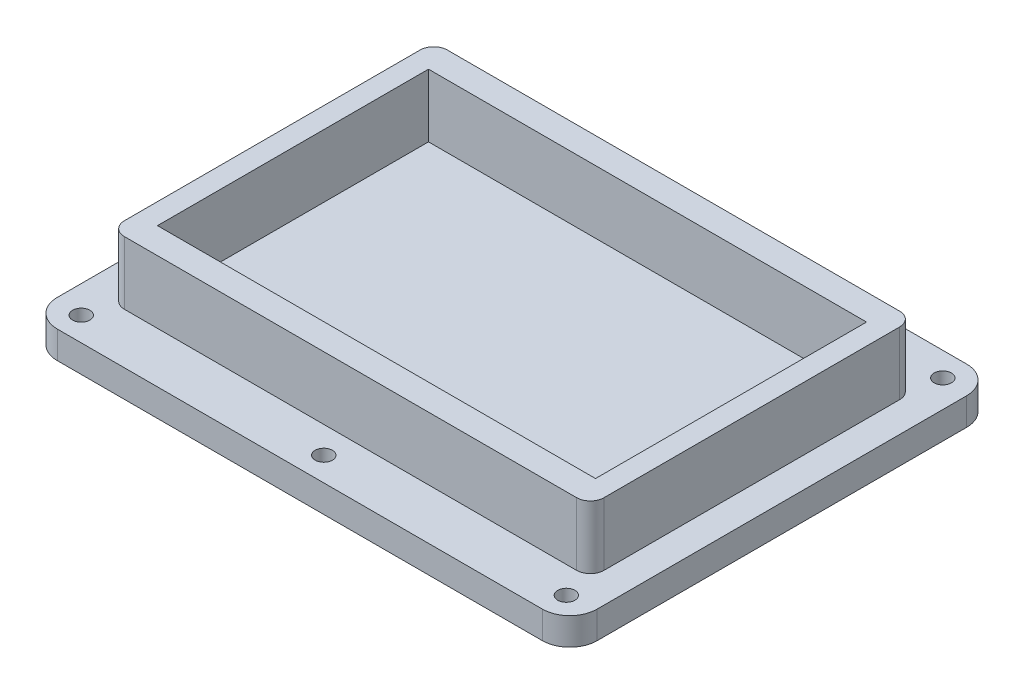
ISO-10303-21;
HEADER;
FILE_DESCRIPTION(('STEP AP214'),'2;1');
FILE_NAME('part.step','',(''),(''),'','','');
FILE_SCHEMA(('AUTOMOTIVE_DESIGN { 1 0 10303 214 1 1 1 1 }'));
ENDSEC;
DATA;
#1=APPLICATION_CONTEXT('core data for automotive mechanical design processes');
#2=APPLICATION_PROTOCOL_DEFINITION('international standard','automotive_design',2000,#1);
#3=PRODUCT_CONTEXT('',#1,'mechanical');
#4=PRODUCT('Part','Part','',(#3));
#5=PRODUCT_RELATED_PRODUCT_CATEGORY('part','',(#4));
#6=PRODUCT_DEFINITION_FORMATION('','',#4);
#7=PRODUCT_DEFINITION_CONTEXT('part definition',#1,'design');
#8=PRODUCT_DEFINITION('design','',#6,#7);
#9=PRODUCT_DEFINITION_SHAPE('','',#8);
#10=(LENGTH_UNIT() NAMED_UNIT(*) SI_UNIT(.MILLI.,.METRE.));
#11=(NAMED_UNIT(*) PLANE_ANGLE_UNIT() SI_UNIT($,.RADIAN.));
#12=(NAMED_UNIT(*) SI_UNIT($,.STERADIAN.) SOLID_ANGLE_UNIT());
#13=UNCERTAINTY_MEASURE_WITH_UNIT(LENGTH_MEASURE(1.E-05),#10,'distance_accuracy_value','');
#14=(GEOMETRIC_REPRESENTATION_CONTEXT(3) GLOBAL_UNCERTAINTY_ASSIGNED_CONTEXT((#13)) GLOBAL_UNIT_ASSIGNED_CONTEXT((#10,
#11,#12)) REPRESENTATION_CONTEXT('',''));
#15=CARTESIAN_POINT('',(0.,0.,0.));
#16=DIRECTION('',(0.,0.,1.));
#17=DIRECTION('',(1.,0.,0.));
#18=AXIS2_PLACEMENT_3D('',#15,#16,#17);
#19=CARTESIAN_POINT('',(0.,2.54,0.));
#20=DIRECTION('',(0.,1.,0.));
#21=DIRECTION('',(0.,0.,1.));
#22=AXIS2_PLACEMENT_3D('',#19,#20,#21);
#23=PLANE('',#22);
#24=CARTESIAN_POINT('',(-62.319486882684,2.54,-17.1109355296889));
#25=DIRECTION('',(0.,1.,0.));
#26=DIRECTION('',(0.,0.,1.));
#27=AXIS2_PLACEMENT_3D('',#24,#25,#26);
#28=CIRCLE('',#27,0.799999999999992);
#29=CARTESIAN_POINT('',(-62.319486882684,2.54,-16.3109355296889));
#30=VERTEX_POINT('',#29);
#31=EDGE_CURVE('E212',#30,#30,#28,.T.);
#32=ORIENTED_EDGE('',*,*,#31,.F.);
#33=EDGE_LOOP('',(#32));
#34=FACE_BOUND('',#33,.T.);
#35=CARTESIAN_POINT('',(-39.815086882684,2.54,-17.1109355296889));
#36=DIRECTION('',(0.,1.,0.));
#37=DIRECTION('',(0.,0.,1.));
#38=AXIS2_PLACEMENT_3D('',#35,#36,#37);
#39=CIRCLE('',#38,0.799999999999992);
#40=CARTESIAN_POINT('',(-39.815086882684,2.54,-16.3109355296889));
#41=VERTEX_POINT('',#40);
#42=EDGE_CURVE('E218',#41,#41,#39,.T.);
#43=ORIENTED_EDGE('',*,*,#42,.F.);
#44=EDGE_LOOP('',(#43));
#45=FACE_BOUND('',#44,.T.);
#46=CARTESIAN_POINT('',(-17.310686882684,2.54,-17.1109355296889));
#47=DIRECTION('',(0.,1.,0.));
#48=DIRECTION('',(0.,0.,1.));
#49=AXIS2_PLACEMENT_3D('',#46,#47,#48);
#50=CIRCLE('',#49,0.799999999999993);
#51=CARTESIAN_POINT('',(-17.310686882684,2.54,-16.3109355296889));
#52=VERTEX_POINT('',#51);
#53=EDGE_CURVE('E224',#52,#52,#50,.T.);
#54=ORIENTED_EDGE('',*,*,#53,.F.);
#55=EDGE_LOOP('',(#54));
#56=FACE_BOUND('',#55,.T.);
#57=CARTESIAN_POINT('',(-17.310686882684,2.54,-52.0359355296889));
#58=DIRECTION('',(0.,1.,0.));
#59=DIRECTION('',(0.,0.,1.));
#60=AXIS2_PLACEMENT_3D('',#57,#58,#59);
#61=CIRCLE('',#60,0.799999999999993);
#62=CARTESIAN_POINT('',(-17.310686882684,2.54,-51.2359355296889));
#63=VERTEX_POINT('',#62);
#64=EDGE_CURVE('E230',#63,#63,#61,.T.);
#65=ORIENTED_EDGE('',*,*,#64,.F.);
#66=EDGE_LOOP('',(#65));
#67=FACE_BOUND('',#66,.T.);
#68=CARTESIAN_POINT('',(-39.815086882684,2.54,-52.0359355296889));
#69=DIRECTION('',(0.,1.,0.));
#70=DIRECTION('',(0.,0.,1.));
#71=AXIS2_PLACEMENT_3D('',#68,#69,#70);
#72=CIRCLE('',#71,0.799999999999992);
#73=CARTESIAN_POINT('',(-39.815086882684,2.54,-51.2359355296889));
#74=VERTEX_POINT('',#73);
#75=EDGE_CURVE('E236',#74,#74,#72,.T.);
#76=ORIENTED_EDGE('',*,*,#75,.F.);
#77=EDGE_LOOP('',(#76));
#78=FACE_BOUND('',#77,.T.);
#79=CARTESIAN_POINT('',(-62.319486882684,2.54,-52.0359355296889));
#80=DIRECTION('',(0.,1.,0.));
#81=DIRECTION('',(0.,0.,1.));
#82=AXIS2_PLACEMENT_3D('',#79,#80,#81);
#83=CIRCLE('',#82,0.799999999999992);
#84=CARTESIAN_POINT('',(-62.319486882684,2.54,-51.2359355296889));
#85=VERTEX_POINT('',#84);
#86=EDGE_CURVE('E242',#85,#85,#83,.T.);
#87=ORIENTED_EDGE('',*,*,#86,.F.);
#88=EDGE_LOOP('',(#87));
#89=FACE_BOUND('',#88,.T.);
#90=DIRECTION('',(0.,0.,1.));
#91=VECTOR('',#90,1.);
#92=CARTESIAN_POINT('',(-64.859486882684,2.54,-54.2584355296889));
#93=LINE('',#92,#91);
#94=CARTESIAN_POINT('',(-64.859486882684,2.54,-51.7184355296889));
#95=VERTEX_POINT('',#94);
#96=CARTESIAN_POINT('',(-64.859486882684,2.54,-17.4284355296889));
#97=VERTEX_POINT('',#96);
#98=EDGE_CURVE('E269',#95,#97,#93,.T.);
#99=ORIENTED_EDGE('',*,*,#98,.T.);
#100=CARTESIAN_POINT('',(-62.319486882684,2.54,-17.4284355296889));
#101=DIRECTION('',(0.,1.,0.));
#102=DIRECTION('',(0.,0.,1.));
#103=AXIS2_PLACEMENT_3D('',#100,#101,#102);
#104=CIRCLE('',#103,2.54);
#105=CARTESIAN_POINT('',(-62.319486882684,2.54,-14.8884355296889));
#106=VERTEX_POINT('',#105);
#107=EDGE_CURVE('E316',#97,#106,#104,.T.);
#108=ORIENTED_EDGE('',*,*,#107,.T.);
#109=DIRECTION('',(1.,0.,0.));
#110=VECTOR('',#109,1.);
#111=CARTESIAN_POINT('',(-64.859486882684,2.54,-14.8884355296889));
#112=LINE('',#111,#110);
#113=CARTESIAN_POINT('',(-17.310686882684,2.54,-14.8884355296889));
#114=VERTEX_POINT('',#113);
#115=EDGE_CURVE('E272',#106,#114,#112,.T.);
#116=ORIENTED_EDGE('',*,*,#115,.T.);
#117=CARTESIAN_POINT('',(-17.310686882684,2.54,-17.4284355296889));
#118=DIRECTION('',(0.,1.,0.));
#119=DIRECTION('',(0.,0.,1.));
#120=AXIS2_PLACEMENT_3D('',#117,#118,#119);
#121=CIRCLE('',#120,2.54);
#122=CARTESIAN_POINT('',(-14.770686882684,2.54,-17.4284355296889));
#123=VERTEX_POINT('',#122);
#124=EDGE_CURVE('E314',#114,#123,#121,.T.);
#125=ORIENTED_EDGE('',*,*,#124,.T.);
#126=DIRECTION('',(0.,0.,-1.));
#127=VECTOR('',#126,1.);
#128=CARTESIAN_POINT('',(-14.770686882684,2.54,-54.2584355296889));
#129=LINE('',#128,#127);
#130=CARTESIAN_POINT('',(-14.770686882684,2.54,-51.7184355296889));
#131=VERTEX_POINT('',#130);
#132=EDGE_CURVE('E276',#123,#131,#129,.T.);
#133=ORIENTED_EDGE('',*,*,#132,.T.);
#134=CARTESIAN_POINT('',(-17.310686882684,2.54,-51.7184355296889));
#135=DIRECTION('',(0.,1.,0.));
#136=DIRECTION('',(0.,0.,1.));
#137=AXIS2_PLACEMENT_3D('',#134,#135,#136);
#138=CIRCLE('',#137,2.54);
#139=CARTESIAN_POINT('',(-17.310686882684,2.54,-54.2584355296889));
#140=VERTEX_POINT('',#139);
#141=EDGE_CURVE('E312',#131,#140,#138,.T.);
#142=ORIENTED_EDGE('',*,*,#141,.T.);
#143=DIRECTION('',(-1.,0.,0.));
#144=VECTOR('',#143,1.);
#145=CARTESIAN_POINT('',(-64.859486882684,2.54,-54.2584355296889));
#146=LINE('',#145,#144);
#147=CARTESIAN_POINT('',(-62.319486882684,2.54,-54.2584355296889));
#148=VERTEX_POINT('',#147);
#149=EDGE_CURVE('E279',#140,#148,#146,.T.);
#150=ORIENTED_EDGE('',*,*,#149,.T.);
#151=CARTESIAN_POINT('',(-62.319486882684,2.54,-51.7184355296889));
#152=DIRECTION('',(0.,1.,0.));
#153=DIRECTION('',(0.,0.,1.));
#154=AXIS2_PLACEMENT_3D('',#151,#152,#153);
#155=CIRCLE('',#154,2.54);
#156=EDGE_CURVE('E310',#148,#95,#155,.T.);
#157=ORIENTED_EDGE('',*,*,#156,.T.);
#158=EDGE_LOOP('',(#99,#108,#116,#125,#133,#142,#150,#157));
#159=FACE_BOUND('',#158,.T.);
#160=DIRECTION('',(1.,0.,0.));
#161=VECTOR('',#160,1.);
#162=CARTESIAN_POINT('',(-62.065486882684,2.54,-19.5874355296889));
#163=LINE('',#162,#161);
#164=CARTESIAN_POINT('',(-60.795486882684,2.54,-19.5874355296889));
#165=VERTEX_POINT('',#164);
#166=CARTESIAN_POINT('',(-18.834686882684,2.54,-19.5874355296889));
#167=VERTEX_POINT('',#166);
#168=EDGE_CURVE('E262',#165,#167,#163,.T.);
#169=ORIENTED_EDGE('',*,*,#168,.F.);
#170=CARTESIAN_POINT('',(-60.795486882684,2.54,-20.8574355296889));
#171=DIRECTION('',(0.,1.,0.));
#172=DIRECTION('',(0.,0.,1.));
#173=AXIS2_PLACEMENT_3D('',#170,#171,#172);
#174=CIRCLE('',#173,1.27);
#175=CARTESIAN_POINT('',(-62.065486882684,2.54,-20.8574355296889));
#176=VERTEX_POINT('',#175);
#177=EDGE_CURVE('E356',#165,#176,#174,.F.);
#178=ORIENTED_EDGE('',*,*,#177,.T.);
#179=DIRECTION('',(0.,0.,1.));
#180=VECTOR('',#179,1.);
#181=CARTESIAN_POINT('',(-62.065486882684,2.54,-49.5594355296889));
#182=LINE('',#181,#180);
#183=CARTESIAN_POINT('',(-62.065486882684,2.54,-48.2894355296889));
#184=VERTEX_POINT('',#183);
#185=EDGE_CURVE('E245',#184,#176,#182,.T.);
#186=ORIENTED_EDGE('',*,*,#185,.F.);
#187=CARTESIAN_POINT('',(-60.795486882684,2.54,-48.2894355296889));
#188=DIRECTION('',(0.,1.,0.));
#189=DIRECTION('',(0.,0.,1.));
#190=AXIS2_PLACEMENT_3D('',#187,#188,#189);
#191=CIRCLE('',#190,1.27);
#192=CARTESIAN_POINT('',(-60.795486882684,2.54,-49.5594355296889));
#193=VERTEX_POINT('',#192);
#194=EDGE_CURVE('E11',#184,#193,#191,.F.);
#195=ORIENTED_EDGE('',*,*,#194,.T.);
#196=DIRECTION('',(-1.,0.,0.));
#197=VECTOR('',#196,1.);
#198=CARTESIAN_POINT('',(-62.065486882684,2.54,-49.5594355296889));
#199=LINE('',#198,#197);
#200=CARTESIAN_POINT('',(-18.834686882684,2.54,-49.5594355296889));
#201=VERTEX_POINT('',#200);
#202=EDGE_CURVE('E250',#201,#193,#199,.T.);
#203=ORIENTED_EDGE('',*,*,#202,.F.);
#204=CARTESIAN_POINT('',(-18.834686882684,2.54,-48.2894355296889));
#205=DIRECTION('',(0.,1.,0.));
#206=DIRECTION('',(0.,0.,1.));
#207=AXIS2_PLACEMENT_3D('',#204,#205,#206);
#208=CIRCLE('',#207,1.27);
#209=CARTESIAN_POINT('',(-17.564686882684,2.54,-48.2894355296889));
#210=VERTEX_POINT('',#209);
#211=EDGE_CURVE('E43',#201,#210,#208,.F.);
#212=ORIENTED_EDGE('',*,*,#211,.T.);
#213=DIRECTION('',(0.,0.,-1.));
#214=VECTOR('',#213,1.);
#215=CARTESIAN_POINT('',(-17.564686882684,2.54,-49.5594355296889));
#216=LINE('',#215,#214);
#217=CARTESIAN_POINT('',(-17.564686882684,2.54,-20.8574355296889));
#218=VERTEX_POINT('',#217);
#219=EDGE_CURVE('E265',#218,#210,#216,.T.);
#220=ORIENTED_EDGE('',*,*,#219,.F.);
#221=CARTESIAN_POINT('',(-18.834686882684,2.54,-20.8574355296889));
#222=DIRECTION('',(0.,1.,0.));
#223=DIRECTION('',(0.,0.,1.));
#224=AXIS2_PLACEMENT_3D('',#221,#222,#223);
#225=CIRCLE('',#224,1.27);
#226=EDGE_CURVE('E358',#218,#167,#225,.F.);
#227=ORIENTED_EDGE('',*,*,#226,.T.);
#228=EDGE_LOOP('',(#169,#178,#186,#195,#203,#212,#220,#227));
#229=FACE_BOUND('',#228,.T.);
#230=ADVANCED_FACE('F35',(#34,#45,#56,#67,#78,#89,#159,#229),#23,.T.);
#231=CARTESIAN_POINT('',(-64.859486882684,2.54,-54.2584355296889));
#232=DIRECTION('',(1.,0.,0.));
#233=DIRECTION('',(0.,0.,-1.));
#234=AXIS2_PLACEMENT_3D('',#231,#232,#233);
#235=PLANE('',#234);
#236=DIRECTION('',(0.,0.,1.));
#237=VECTOR('',#236,1.);
#238=CARTESIAN_POINT('',(-64.859486882684,0.,-54.2584355296889));
#239=LINE('',#238,#237);
#240=CARTESIAN_POINT('',(-64.859486882684,0.,-51.7184355296889));
#241=VERTEX_POINT('',#240);
#242=CARTESIAN_POINT('',(-64.859486882684,0.,-17.4284355296889));
#243=VERTEX_POINT('',#242);
#244=EDGE_CURVE('E259',#241,#243,#239,.T.);
#245=ORIENTED_EDGE('',*,*,#244,.T.);
#246=DIRECTION('',(0.,-1.,0.));
#247=VECTOR('',#246,1.);
#248=CARTESIAN_POINT('',(-64.859486882684,2.54,-17.4284355296889));
#249=LINE('',#248,#247);
#250=EDGE_CURVE('E308',#243,#97,#249,.F.);
#251=ORIENTED_EDGE('',*,*,#250,.T.);
#252=ORIENTED_EDGE('',*,*,#98,.F.);
#253=DIRECTION('',(0.,-1.,0.));
#254=VECTOR('',#253,1.);
#255=CARTESIAN_POINT('',(-64.859486882684,2.54,-51.7184355296889));
#256=LINE('',#255,#254);
#257=EDGE_CURVE('E305',#95,#241,#256,.T.);
#258=ORIENTED_EDGE('',*,*,#257,.T.);
#259=EDGE_LOOP('',(#245,#251,#252,#258));
#260=FACE_BOUND('',#259,.T.);
#261=ADVANCED_FACE('F403',(#260),#235,.F.);
#262=CARTESIAN_POINT('',(-64.859486882684,2.54,-14.8884355296889));
#263=DIRECTION('',(0.,0.,-1.));
#264=DIRECTION('',(-1.,0.,0.));
#265=AXIS2_PLACEMENT_3D('',#262,#263,#264);
#266=PLANE('',#265);
#267=ORIENTED_EDGE('',*,*,#115,.F.);
#268=DIRECTION('',(0.,-1.,0.));
#269=VECTOR('',#268,1.);
#270=CARTESIAN_POINT('',(-62.319486882684,2.54,-14.8884355296889));
#271=LINE('',#270,#269);
#272=CARTESIAN_POINT('',(-62.319486882684,0.,-14.8884355296889));
#273=VERTEX_POINT('',#272);
#274=EDGE_CURVE('E294',#106,#273,#271,.T.);
#275=ORIENTED_EDGE('',*,*,#274,.T.);
#276=DIRECTION('',(1.,0.,0.));
#277=VECTOR('',#276,1.);
#278=CARTESIAN_POINT('',(-64.859486882684,0.,-14.8884355296889));
#279=LINE('',#278,#277);
#280=CARTESIAN_POINT('',(-17.310686882684,0.,-14.8884355296889));
#281=VERTEX_POINT('',#280);
#282=EDGE_CURVE('E285',#273,#281,#279,.T.);
#283=ORIENTED_EDGE('',*,*,#282,.T.);
#284=DIRECTION('',(0.,-1.,0.));
#285=VECTOR('',#284,1.);
#286=CARTESIAN_POINT('',(-17.310686882684,2.54,-14.8884355296889));
#287=LINE('',#286,#285);
#288=EDGE_CURVE('E282',#281,#114,#287,.F.);
#289=ORIENTED_EDGE('',*,*,#288,.T.);
#290=EDGE_LOOP('',(#267,#275,#283,#289));
#291=FACE_BOUND('',#290,.T.);
#292=ADVANCED_FACE('F409',(#291),#266,.F.);
#293=CARTESIAN_POINT('',(-14.770686882684,2.54,-54.2584355296889));
#294=DIRECTION('',(-1.,0.,0.));
#295=DIRECTION('',(0.,0.,1.));
#296=AXIS2_PLACEMENT_3D('',#293,#294,#295);
#297=PLANE('',#296);
#298=ORIENTED_EDGE('',*,*,#132,.F.);
#299=DIRECTION('',(0.,-1.,0.));
#300=VECTOR('',#299,1.);
#301=CARTESIAN_POINT('',(-14.770686882684,2.54,-17.4284355296889));
#302=LINE('',#301,#300);
#303=CARTESIAN_POINT('',(-14.770686882684,0.,-17.4284355296889));
#304=VERTEX_POINT('',#303);
#305=EDGE_CURVE('E320',#123,#304,#302,.T.);
#306=ORIENTED_EDGE('',*,*,#305,.T.);
#307=DIRECTION('',(0.,0.,-1.));
#308=VECTOR('',#307,1.);
#309=CARTESIAN_POINT('',(-14.770686882684,0.,-54.2584355296889));
#310=LINE('',#309,#308);
#311=CARTESIAN_POINT('',(-14.770686882684,0.,-51.7184355296889));
#312=VERTEX_POINT('',#311);
#313=EDGE_CURVE('E288',#304,#312,#310,.T.);
#314=ORIENTED_EDGE('',*,*,#313,.T.);
#315=DIRECTION('',(0.,-1.,0.));
#316=VECTOR('',#315,1.);
#317=CARTESIAN_POINT('',(-14.770686882684,2.54,-51.7184355296889));
#318=LINE('',#317,#316);
#319=EDGE_CURVE('E318',#312,#131,#318,.F.);
#320=ORIENTED_EDGE('',*,*,#319,.T.);
#321=EDGE_LOOP('',(#298,#306,#314,#320));
#322=FACE_BOUND('',#321,.T.);
#323=ADVANCED_FACE('F424',(#322),#297,.F.);
#324=CARTESIAN_POINT('',(-64.859486882684,2.54,-54.2584355296889));
#325=DIRECTION('',(0.,0.,1.));
#326=DIRECTION('',(1.,0.,0.));
#327=AXIS2_PLACEMENT_3D('',#324,#325,#326);
#328=PLANE('',#327);
#329=ORIENTED_EDGE('',*,*,#149,.F.);
#330=DIRECTION('',(0.,-1.,0.));
#331=VECTOR('',#330,1.);
#332=CARTESIAN_POINT('',(-17.310686882684,2.54,-54.2584355296889));
#333=LINE('',#332,#331);
#334=CARTESIAN_POINT('',(-17.310686882684,0.,-54.2584355296889));
#335=VERTEX_POINT('',#334);
#336=EDGE_CURVE('E325',#140,#335,#333,.T.);
#337=ORIENTED_EDGE('',*,*,#336,.T.);
#338=DIRECTION('',(-1.,0.,0.));
#339=VECTOR('',#338,1.);
#340=CARTESIAN_POINT('',(-64.859486882684,0.,-54.2584355296889));
#341=LINE('',#340,#339);
#342=CARTESIAN_POINT('',(-62.319486882684,0.,-54.2584355296889));
#343=VERTEX_POINT('',#342);
#344=EDGE_CURVE('E273',#335,#343,#341,.T.);
#345=ORIENTED_EDGE('',*,*,#344,.T.);
#346=DIRECTION('',(0.,-1.,0.));
#347=VECTOR('',#346,1.);
#348=CARTESIAN_POINT('',(-62.319486882684,2.54,-54.2584355296889));
#349=LINE('',#348,#347);
#350=EDGE_CURVE('E323',#343,#148,#349,.F.);
#351=ORIENTED_EDGE('',*,*,#350,.T.);
#352=EDGE_LOOP('',(#329,#337,#345,#351));
#353=FACE_BOUND('',#352,.T.);
#354=ADVANCED_FACE('F420',(#353),#328,.F.);
#355=CARTESIAN_POINT('',(0.,0.,0.));
#356=DIRECTION('',(0.,1.,0.));
#357=DIRECTION('',(0.,0.,1.));
#358=AXIS2_PLACEMENT_3D('',#355,#356,#357);
#359=PLANE('',#358);
#360=CARTESIAN_POINT('',(-62.319486882684,0.,-17.1109355296889));
#361=DIRECTION('',(0.,-1.,0.));
#362=DIRECTION('',(0.,0.,-1.));
#363=AXIS2_PLACEMENT_3D('',#360,#361,#362);
#364=CIRCLE('',#363,0.799999999999988);
#365=CARTESIAN_POINT('',(-62.319486882684,0.,-17.9109355296889));
#366=VERTEX_POINT('',#365);
#367=EDGE_CURVE('E206',#366,#366,#364,.T.);
#368=ORIENTED_EDGE('',*,*,#367,.F.);
#369=EDGE_LOOP('',(#368));
#370=FACE_BOUND('',#369,.T.);
#371=CARTESIAN_POINT('',(-39.815086882684,0.,-17.1109355296889));
#372=DIRECTION('',(0.,-1.,0.));
#373=DIRECTION('',(0.,0.,-1.));
#374=AXIS2_PLACEMENT_3D('',#371,#372,#373);
#375=CIRCLE('',#374,0.799999999999988);
#376=CARTESIAN_POINT('',(-39.815086882684,0.,-17.9109355296889));
#377=VERTEX_POINT('',#376);
#378=EDGE_CURVE('E215',#377,#377,#375,.T.);
#379=ORIENTED_EDGE('',*,*,#378,.F.);
#380=EDGE_LOOP('',(#379));
#381=FACE_BOUND('',#380,.T.);
#382=CARTESIAN_POINT('',(-17.310686882684,0.,-17.1109355296889));
#383=DIRECTION('',(0.,-1.,0.));
#384=DIRECTION('',(0.,0.,-1.));
#385=AXIS2_PLACEMENT_3D('',#382,#383,#384);
#386=CIRCLE('',#385,0.799999999999988);
#387=CARTESIAN_POINT('',(-17.310686882684,0.,-17.9109355296889));
#388=VERTEX_POINT('',#387);
#389=EDGE_CURVE('E221',#388,#388,#386,.T.);
#390=ORIENTED_EDGE('',*,*,#389,.F.);
#391=EDGE_LOOP('',(#390));
#392=FACE_BOUND('',#391,.T.);
#393=CARTESIAN_POINT('',(-17.310686882684,0.,-52.0359355296889));
#394=DIRECTION('',(0.,-1.,0.));
#395=DIRECTION('',(0.,0.,-1.));
#396=AXIS2_PLACEMENT_3D('',#393,#394,#395);
#397=CIRCLE('',#396,0.799999999999988);
#398=CARTESIAN_POINT('',(-17.310686882684,0.,-52.8359355296889));
#399=VERTEX_POINT('',#398);
#400=EDGE_CURVE('E227',#399,#399,#397,.T.);
#401=ORIENTED_EDGE('',*,*,#400,.F.);
#402=EDGE_LOOP('',(#401));
#403=FACE_BOUND('',#402,.T.);
#404=CARTESIAN_POINT('',(-39.815086882684,0.,-52.0359355296889));
#405=DIRECTION('',(0.,-1.,0.));
#406=DIRECTION('',(0.,0.,-1.));
#407=AXIS2_PLACEMENT_3D('',#404,#405,#406);
#408=CIRCLE('',#407,0.799999999999988);
#409=CARTESIAN_POINT('',(-39.815086882684,0.,-52.8359355296889));
#410=VERTEX_POINT('',#409);
#411=EDGE_CURVE('E233',#410,#410,#408,.T.);
#412=ORIENTED_EDGE('',*,*,#411,.F.);
#413=EDGE_LOOP('',(#412));
#414=FACE_BOUND('',#413,.T.);
#415=CARTESIAN_POINT('',(-62.319486882684,0.,-52.0359355296889));
#416=DIRECTION('',(0.,-1.,0.));
#417=DIRECTION('',(0.,0.,-1.));
#418=AXIS2_PLACEMENT_3D('',#415,#416,#417);
#419=CIRCLE('',#418,0.799999999999988);
#420=CARTESIAN_POINT('',(-62.319486882684,0.,-52.8359355296889));
#421=VERTEX_POINT('',#420);
#422=EDGE_CURVE('E239',#421,#421,#419,.T.);
#423=ORIENTED_EDGE('',*,*,#422,.F.);
#424=EDGE_LOOP('',(#423));
#425=FACE_BOUND('',#424,.T.);
#426=ORIENTED_EDGE('',*,*,#282,.F.);
#427=CARTESIAN_POINT('',(-62.319486882684,0.,-17.4284355296889));
#428=DIRECTION('',(0.,1.,0.));
#429=DIRECTION('',(0.,0.,1.));
#430=AXIS2_PLACEMENT_3D('',#427,#428,#429);
#431=CIRCLE('',#430,2.54);
#432=EDGE_CURVE('E303',#273,#243,#431,.F.);
#433=ORIENTED_EDGE('',*,*,#432,.T.);
#434=ORIENTED_EDGE('',*,*,#244,.F.);
#435=CARTESIAN_POINT('',(-62.319486882684,0.,-51.7184355296889));
#436=DIRECTION('',(0.,1.,0.));
#437=DIRECTION('',(0.,0.,1.));
#438=AXIS2_PLACEMENT_3D('',#435,#436,#437);
#439=CIRCLE('',#438,2.54);
#440=EDGE_CURVE('E297',#241,#343,#439,.F.);
#441=ORIENTED_EDGE('',*,*,#440,.T.);
#442=ORIENTED_EDGE('',*,*,#344,.F.);
#443=CARTESIAN_POINT('',(-17.310686882684,0.,-51.7184355296889));
#444=DIRECTION('',(0.,1.,0.));
#445=DIRECTION('',(0.,0.,1.));
#446=AXIS2_PLACEMENT_3D('',#443,#444,#445);
#447=CIRCLE('',#446,2.54);
#448=EDGE_CURVE('E299',#335,#312,#447,.F.);
#449=ORIENTED_EDGE('',*,*,#448,.T.);
#450=ORIENTED_EDGE('',*,*,#313,.F.);
#451=CARTESIAN_POINT('',(-17.310686882684,0.,-17.4284355296889));
#452=DIRECTION('',(0.,1.,0.));
#453=DIRECTION('',(0.,0.,1.));
#454=AXIS2_PLACEMENT_3D('',#451,#452,#453);
#455=CIRCLE('',#454,2.54);
#456=EDGE_CURVE('E301',#304,#281,#455,.F.);
#457=ORIENTED_EDGE('',*,*,#456,.T.);
#458=EDGE_LOOP('',(#426,#433,#434,#441,#442,#449,#450,#457));
#459=FACE_BOUND('',#458,.T.);
#460=ADVANCED_FACE('F417',(#370,#381,#392,#403,#414,#425,#459),#359,.F.);
#461=CARTESIAN_POINT('',(-62.065486882684,8.382,-49.5594355296889));
#462=DIRECTION('',(1.,0.,0.));
#463=DIRECTION('',(0.,0.,-1.));
#464=AXIS2_PLACEMENT_3D('',#461,#462,#463);
#465=PLANE('',#464);
#466=ORIENTED_EDGE('',*,*,#185,.T.);
#467=DIRECTION('',(0.,-1.,0.));
#468=VECTOR('',#467,1.);
#469=CARTESIAN_POINT('',(-62.065486882684,8.382,-20.8574355296889));
#470=LINE('',#469,#468);
#471=CARTESIAN_POINT('',(-62.065486882684,8.382,-20.8574355296889));
#472=VERTEX_POINT('',#471);
#473=EDGE_CURVE('E336',#176,#472,#470,.F.);
#474=ORIENTED_EDGE('',*,*,#473,.T.);
#475=DIRECTION('',(0.,0.,1.));
#476=VECTOR('',#475,1.);
#477=CARTESIAN_POINT('',(-62.065486882684,8.382,-49.5594355296889));
#478=LINE('',#477,#476);
#479=CARTESIAN_POINT('',(-62.065486882684,8.382,-48.2894355296889));
#480=VERTEX_POINT('',#479);
#481=EDGE_CURVE('E246',#480,#472,#478,.T.);
#482=ORIENTED_EDGE('',*,*,#481,.F.);
#483=DIRECTION('',(0.,-1.,0.));
#484=VECTOR('',#483,1.);
#485=CARTESIAN_POINT('',(-62.065486882684,8.382,-48.2894355296889));
#486=LINE('',#485,#484);
#487=EDGE_CURVE('E333',#480,#184,#486,.T.);
#488=ORIENTED_EDGE('',*,*,#487,.T.);
#489=EDGE_LOOP('',(#466,#474,#482,#488));
#490=FACE_BOUND('',#489,.T.);
#491=ADVANCED_FACE('F382',(#490),#465,.F.);
#492=CARTESIAN_POINT('',(-62.065486882684,8.382,-19.5874355296889));
#493=DIRECTION('',(0.,0.,-1.));
#494=DIRECTION('',(-1.,0.,0.));
#495=AXIS2_PLACEMENT_3D('',#492,#493,#494);
#496=PLANE('',#495);
#497=DIRECTION('',(1.,0.,0.));
#498=VECTOR('',#497,1.);
#499=CARTESIAN_POINT('',(-62.065486882684,8.382,-19.5874355296889));
#500=LINE('',#499,#498);
#501=CARTESIAN_POINT('',(-60.795486882684,8.382,-19.5874355296889));
#502=VERTEX_POINT('',#501);
#503=CARTESIAN_POINT('',(-18.834686882684,8.382,-19.5874355296889));
#504=VERTEX_POINT('',#503);
#505=EDGE_CURVE('E249',#502,#504,#500,.T.);
#506=ORIENTED_EDGE('',*,*,#505,.F.);
#507=DIRECTION('',(0.,-1.,0.));
#508=VECTOR('',#507,1.);
#509=CARTESIAN_POINT('',(-60.795486882684,8.382,-19.5874355296889));
#510=LINE('',#509,#508);
#511=EDGE_CURVE('E330',#502,#165,#510,.T.);
#512=ORIENTED_EDGE('',*,*,#511,.T.);
#513=ORIENTED_EDGE('',*,*,#168,.T.);
#514=DIRECTION('',(0.,-1.,0.));
#515=VECTOR('',#514,1.);
#516=CARTESIAN_POINT('',(-18.834686882684,8.382,-19.5874355296889));
#517=LINE('',#516,#515);
#518=EDGE_CURVE('E328',#167,#504,#517,.F.);
#519=ORIENTED_EDGE('',*,*,#518,.T.);
#520=EDGE_LOOP('',(#506,#512,#513,#519));
#521=FACE_BOUND('',#520,.T.);
#522=ADVANCED_FACE('F390',(#521),#496,.F.);
#523=CARTESIAN_POINT('',(-17.564686882684,8.382,-49.5594355296889));
#524=DIRECTION('',(-1.,0.,0.));
#525=DIRECTION('',(0.,0.,1.));
#526=AXIS2_PLACEMENT_3D('',#523,#524,#525);
#527=PLANE('',#526);
#528=DIRECTION('',(0.,0.,-1.));
#529=VECTOR('',#528,1.);
#530=CARTESIAN_POINT('',(-17.564686882684,8.382,-49.5594355296889));
#531=LINE('',#530,#529);
#532=CARTESIAN_POINT('',(-17.564686882684,8.382,-20.8574355296889));
#533=VERTEX_POINT('',#532);
#534=CARTESIAN_POINT('',(-17.564686882684,8.382,-48.2894355296889));
#535=VERTEX_POINT('',#534);
#536=EDGE_CURVE('E253',#533,#535,#531,.T.);
#537=ORIENTED_EDGE('',*,*,#536,.F.);
#538=DIRECTION('',(0.,-1.,0.));
#539=VECTOR('',#538,1.);
#540=CARTESIAN_POINT('',(-17.564686882684,8.382,-20.8574355296889));
#541=LINE('',#540,#539);
#542=EDGE_CURVE('E348',#533,#218,#541,.T.);
#543=ORIENTED_EDGE('',*,*,#542,.T.);
#544=ORIENTED_EDGE('',*,*,#219,.T.);
#545=DIRECTION('',(0.,-1.,0.));
#546=VECTOR('',#545,1.);
#547=CARTESIAN_POINT('',(-17.564686882684,8.382,-48.2894355296889));
#548=LINE('',#547,#546);
#549=EDGE_CURVE('E346',#210,#535,#548,.F.);
#550=ORIENTED_EDGE('',*,*,#549,.T.);
#551=EDGE_LOOP('',(#537,#543,#544,#550));
#552=FACE_BOUND('',#551,.T.);
#553=ADVANCED_FACE('F366',(#552),#527,.F.);
#554=CARTESIAN_POINT('',(-62.065486882684,8.382,-49.5594355296889));
#555=DIRECTION('',(0.,0.,1.));
#556=DIRECTION('',(1.,0.,0.));
#557=AXIS2_PLACEMENT_3D('',#554,#555,#556);
#558=PLANE('',#557);
#559=DIRECTION('',(-1.,0.,0.));
#560=VECTOR('',#559,1.);
#561=CARTESIAN_POINT('',(-62.065486882684,8.382,-49.5594355296889));
#562=LINE('',#561,#560);
#563=CARTESIAN_POINT('',(-18.834686882684,8.382,-49.5594355296889));
#564=VERTEX_POINT('',#563);
#565=CARTESIAN_POINT('',(-60.795486882684,8.382,-49.5594355296889));
#566=VERTEX_POINT('',#565);
#567=EDGE_CURVE('E256',#564,#566,#562,.T.);
#568=ORIENTED_EDGE('',*,*,#567,.F.);
#569=DIRECTION('',(0.,-1.,0.));
#570=VECTOR('',#569,1.);
#571=CARTESIAN_POINT('',(-18.834686882684,8.382,-49.5594355296889));
#572=LINE('',#571,#570);
#573=EDGE_CURVE('E353',#564,#201,#572,.T.);
#574=ORIENTED_EDGE('',*,*,#573,.T.);
#575=ORIENTED_EDGE('',*,*,#202,.T.);
#576=DIRECTION('',(0.,-1.,0.));
#577=VECTOR('',#576,1.);
#578=CARTESIAN_POINT('',(-60.795486882684,8.382,-49.5594355296889));
#579=LINE('',#578,#577);
#580=EDGE_CURVE('E351',#193,#566,#579,.F.);
#581=ORIENTED_EDGE('',*,*,#580,.T.);
#582=EDGE_LOOP('',(#568,#574,#575,#581));
#583=FACE_BOUND('',#582,.T.);
#584=ADVANCED_FACE('F375',(#583),#558,.F.);
#585=CARTESIAN_POINT('',(0.,8.382,0.));
#586=DIRECTION('',(0.,1.,0.));
#587=DIRECTION('',(0.,0.,1.));
#588=AXIS2_PLACEMENT_3D('',#585,#586,#587);
#589=PLANE('',#588);
#590=DIRECTION('',(0.,0.,1.));
#591=VECTOR('',#590,1.);
#592=CARTESIAN_POINT('',(-60.135086882684,8.382,-22.0004355296889));
#593=LINE('',#592,#591);
#594=CARTESIAN_POINT('',(-60.135086882684,8.382,-47.1464355296889));
#595=VERTEX_POINT('',#594);
#596=CARTESIAN_POINT('',(-60.135086882684,8.382,-22.0004355296889));
#597=VERTEX_POINT('',#596);
#598=EDGE_CURVE('E50',#595,#597,#593,.T.);
#599=ORIENTED_EDGE('',*,*,#598,.F.);
#600=DIRECTION('',(-1.,0.,0.));
#601=VECTOR('',#600,1.);
#602=CARTESIAN_POINT('',(-60.135086882684,8.382,-47.1464355296889));
#603=LINE('',#602,#601);
#604=CARTESIAN_POINT('',(-19.495086882684,8.382,-47.1464355296889));
#605=VERTEX_POINT('',#604);
#606=EDGE_CURVE('E191',#605,#595,#603,.T.);
#607=ORIENTED_EDGE('',*,*,#606,.F.);
#608=DIRECTION('',(0.,0.,-1.));
#609=VECTOR('',#608,1.);
#610=CARTESIAN_POINT('',(-19.495086882684,8.382,-22.0004355296889));
#611=LINE('',#610,#609);
#612=CARTESIAN_POINT('',(-19.495086882684,8.382,-22.0004355296889));
#613=VERTEX_POINT('',#612);
#614=EDGE_CURVE('E194',#613,#605,#611,.T.);
#615=ORIENTED_EDGE('',*,*,#614,.F.);
#616=DIRECTION('',(1.,0.,0.));
#617=VECTOR('',#616,1.);
#618=CARTESIAN_POINT('',(-60.135086882684,8.382,-22.0004355296889));
#619=LINE('',#618,#617);
#620=EDGE_CURVE('E200',#597,#613,#619,.T.);
#621=ORIENTED_EDGE('',*,*,#620,.F.);
#622=EDGE_LOOP('',(#599,#607,#615,#621));
#623=FACE_BOUND('',#622,.T.);
#624=ORIENTED_EDGE('',*,*,#481,.T.);
#625=CARTESIAN_POINT('',(-60.795486882684,8.382,-20.8574355296889));
#626=DIRECTION('',(0.,1.,0.));
#627=DIRECTION('',(0.,0.,1.));
#628=AXIS2_PLACEMENT_3D('',#625,#626,#627);
#629=CIRCLE('',#628,1.27);
#630=EDGE_CURVE('E344',#472,#502,#629,.T.);
#631=ORIENTED_EDGE('',*,*,#630,.T.);
#632=ORIENTED_EDGE('',*,*,#505,.T.);
#633=CARTESIAN_POINT('',(-18.834686882684,8.382,-20.8574355296889));
#634=DIRECTION('',(0.,1.,0.));
#635=DIRECTION('',(0.,0.,1.));
#636=AXIS2_PLACEMENT_3D('',#633,#634,#635);
#637=CIRCLE('',#636,1.27);
#638=EDGE_CURVE('E342',#504,#533,#637,.T.);
#639=ORIENTED_EDGE('',*,*,#638,.T.);
#640=ORIENTED_EDGE('',*,*,#536,.T.);
#641=CARTESIAN_POINT('',(-18.834686882684,8.382,-48.2894355296889));
#642=DIRECTION('',(0.,1.,0.));
#643=DIRECTION('',(0.,0.,1.));
#644=AXIS2_PLACEMENT_3D('',#641,#642,#643);
#645=CIRCLE('',#644,1.27);
#646=EDGE_CURVE('E340',#535,#564,#645,.T.);
#647=ORIENTED_EDGE('',*,*,#646,.T.);
#648=ORIENTED_EDGE('',*,*,#567,.T.);
#649=CARTESIAN_POINT('',(-60.795486882684,8.382,-48.2894355296889));
#650=DIRECTION('',(0.,1.,0.));
#651=DIRECTION('',(0.,0.,1.));
#652=AXIS2_PLACEMENT_3D('',#649,#650,#651);
#653=CIRCLE('',#652,1.27);
#654=EDGE_CURVE('E338',#566,#480,#653,.T.);
#655=ORIENTED_EDGE('',*,*,#654,.T.);
#656=EDGE_LOOP('',(#624,#631,#632,#639,#640,#647,#648,#655));
#657=FACE_BOUND('',#656,.T.);
#658=ADVANCED_FACE('F372',(#623,#657),#589,.T.);
#659=CARTESIAN_POINT('',(-62.319486882684,2.54,-17.4284355296889));
#660=DIRECTION('',(0.,-1.,0.));
#661=DIRECTION('',(0.,0.,-1.));
#662=AXIS2_PLACEMENT_3D('',#659,#660,#661);
#663=CYLINDRICAL_SURFACE('',#662,2.54);
#664=ORIENTED_EDGE('',*,*,#107,.F.);
#665=ORIENTED_EDGE('',*,*,#250,.F.);
#666=ORIENTED_EDGE('',*,*,#432,.F.);
#667=ORIENTED_EDGE('',*,*,#274,.F.);
#668=EDGE_LOOP('',(#664,#665,#666,#667));
#669=FACE_BOUND('',#668,.T.);
#670=ADVANCED_FACE('F432',(#669),#663,.T.);
#671=CARTESIAN_POINT('',(-17.310686882684,2.54,-17.4284355296889));
#672=DIRECTION('',(0.,-1.,0.));
#673=DIRECTION('',(0.,0.,-1.));
#674=AXIS2_PLACEMENT_3D('',#671,#672,#673);
#675=CYLINDRICAL_SURFACE('',#674,2.54);
#676=ORIENTED_EDGE('',*,*,#124,.F.);
#677=ORIENTED_EDGE('',*,*,#288,.F.);
#678=ORIENTED_EDGE('',*,*,#456,.F.);
#679=ORIENTED_EDGE('',*,*,#305,.F.);
#680=EDGE_LOOP('',(#676,#677,#678,#679));
#681=FACE_BOUND('',#680,.T.);
#682=ADVANCED_FACE('F435',(#681),#675,.T.);
#683=CARTESIAN_POINT('',(-17.310686882684,2.54,-51.7184355296889));
#684=DIRECTION('',(0.,-1.,0.));
#685=DIRECTION('',(0.,0.,-1.));
#686=AXIS2_PLACEMENT_3D('',#683,#684,#685);
#687=CYLINDRICAL_SURFACE('',#686,2.54);
#688=ORIENTED_EDGE('',*,*,#141,.F.);
#689=ORIENTED_EDGE('',*,*,#319,.F.);
#690=ORIENTED_EDGE('',*,*,#448,.F.);
#691=ORIENTED_EDGE('',*,*,#336,.F.);
#692=EDGE_LOOP('',(#688,#689,#690,#691));
#693=FACE_BOUND('',#692,.T.);
#694=ADVANCED_FACE('F439',(#693),#687,.T.);
#695=CARTESIAN_POINT('',(-62.319486882684,2.54,-51.7184355296889));
#696=DIRECTION('',(0.,-1.,0.));
#697=DIRECTION('',(0.,0.,-1.));
#698=AXIS2_PLACEMENT_3D('',#695,#696,#697);
#699=CYLINDRICAL_SURFACE('',#698,2.54);
#700=ORIENTED_EDGE('',*,*,#156,.F.);
#701=ORIENTED_EDGE('',*,*,#350,.F.);
#702=ORIENTED_EDGE('',*,*,#440,.F.);
#703=ORIENTED_EDGE('',*,*,#257,.F.);
#704=EDGE_LOOP('',(#700,#701,#702,#703));
#705=FACE_BOUND('',#704,.T.);
#706=ADVANCED_FACE('F400',(#705),#699,.T.);
#707=CARTESIAN_POINT('',(-60.795486882684,8.382,-20.8574355296889));
#708=DIRECTION('',(0.,-1.,0.));
#709=DIRECTION('',(0.,0.,-1.));
#710=AXIS2_PLACEMENT_3D('',#707,#708,#709);
#711=CYLINDRICAL_SURFACE('',#710,1.27);
#712=ORIENTED_EDGE('',*,*,#630,.F.);
#713=ORIENTED_EDGE('',*,*,#473,.F.);
#714=ORIENTED_EDGE('',*,*,#177,.F.);
#715=ORIENTED_EDGE('',*,*,#511,.F.);
#716=EDGE_LOOP('',(#712,#713,#714,#715));
#717=FACE_BOUND('',#716,.T.);
#718=ADVANCED_FACE('F385',(#717),#711,.T.);
#719=CARTESIAN_POINT('',(-18.834686882684,8.382,-20.8574355296889));
#720=DIRECTION('',(0.,-1.,0.));
#721=DIRECTION('',(0.,0.,-1.));
#722=AXIS2_PLACEMENT_3D('',#719,#720,#721);
#723=CYLINDRICAL_SURFACE('',#722,1.27);
#724=ORIENTED_EDGE('',*,*,#638,.F.);
#725=ORIENTED_EDGE('',*,*,#518,.F.);
#726=ORIENTED_EDGE('',*,*,#226,.F.);
#727=ORIENTED_EDGE('',*,*,#542,.F.);
#728=EDGE_LOOP('',(#724,#725,#726,#727));
#729=FACE_BOUND('',#728,.T.);
#730=ADVANCED_FACE('F393',(#729),#723,.T.);
#731=CARTESIAN_POINT('',(-18.834686882684,8.382,-48.2894355296889));
#732=DIRECTION('',(0.,-1.,0.));
#733=DIRECTION('',(0.,0.,-1.));
#734=AXIS2_PLACEMENT_3D('',#731,#732,#733);
#735=CYLINDRICAL_SURFACE('',#734,1.27);
#736=ORIENTED_EDGE('',*,*,#646,.F.);
#737=ORIENTED_EDGE('',*,*,#549,.F.);
#738=ORIENTED_EDGE('',*,*,#211,.F.);
#739=ORIENTED_EDGE('',*,*,#573,.F.);
#740=EDGE_LOOP('',(#736,#737,#738,#739));
#741=FACE_BOUND('',#740,.T.);
#742=ADVANCED_FACE('F369',(#741),#735,.T.);
#743=CARTESIAN_POINT('',(-60.795486882684,8.382,-48.2894355296889));
#744=DIRECTION('',(0.,-1.,0.));
#745=DIRECTION('',(0.,0.,-1.));
#746=AXIS2_PLACEMENT_3D('',#743,#744,#745);
#747=CYLINDRICAL_SURFACE('',#746,1.27);
#748=ORIENTED_EDGE('',*,*,#654,.F.);
#749=ORIENTED_EDGE('',*,*,#580,.F.);
#750=ORIENTED_EDGE('',*,*,#194,.F.);
#751=ORIENTED_EDGE('',*,*,#487,.F.);
#752=EDGE_LOOP('',(#748,#749,#750,#751));
#753=FACE_BOUND('',#752,.T.);
#754=ADVANCED_FACE('F37',(#753),#747,.T.);
#755=CARTESIAN_POINT('',(-62.319486882684,0.,-52.0359355296889));
#756=DIRECTION('',(0.,-1.,0.));
#757=DIRECTION('',(0.,0.,-1.));
#758=AXIS2_PLACEMENT_3D('',#755,#756,#757);
#759=CYLINDRICAL_SURFACE('',#758,0.799999999999992);
#760=ORIENTED_EDGE('',*,*,#86,.T.);
#761=EDGE_LOOP('',(#760));
#762=FACE_BOUND('',#761,.T.);
#763=ORIENTED_EDGE('',*,*,#422,.T.);
#764=EDGE_LOOP('',(#763));
#765=FACE_BOUND('',#764,.T.);
#766=ADVANCED_FACE('F500',(#762,#765),#759,.F.);
#767=CARTESIAN_POINT('',(-39.815086882684,0.,-52.0359355296889));
#768=DIRECTION('',(0.,-1.,0.));
#769=DIRECTION('',(0.,0.,-1.));
#770=AXIS2_PLACEMENT_3D('',#767,#768,#769);
#771=CYLINDRICAL_SURFACE('',#770,0.799999999999992);
#772=ORIENTED_EDGE('',*,*,#75,.T.);
#773=EDGE_LOOP('',(#772));
#774=FACE_BOUND('',#773,.T.);
#775=ORIENTED_EDGE('',*,*,#411,.T.);
#776=EDGE_LOOP('',(#775));
#777=FACE_BOUND('',#776,.T.);
#778=ADVANCED_FACE('F522',(#774,#777),#771,.F.);
#779=CARTESIAN_POINT('',(-17.310686882684,0.,-52.0359355296889));
#780=DIRECTION('',(0.,-1.,0.));
#781=DIRECTION('',(0.,0.,-1.));
#782=AXIS2_PLACEMENT_3D('',#779,#780,#781);
#783=CYLINDRICAL_SURFACE('',#782,0.799999999999993);
#784=ORIENTED_EDGE('',*,*,#64,.T.);
#785=EDGE_LOOP('',(#784));
#786=FACE_BOUND('',#785,.T.);
#787=ORIENTED_EDGE('',*,*,#400,.T.);
#788=EDGE_LOOP('',(#787));
#789=FACE_BOUND('',#788,.T.);
#790=ADVANCED_FACE('F532',(#786,#789),#783,.F.);
#791=CARTESIAN_POINT('',(-17.310686882684,0.,-17.1109355296889));
#792=DIRECTION('',(0.,-1.,0.));
#793=DIRECTION('',(0.,0.,-1.));
#794=AXIS2_PLACEMENT_3D('',#791,#792,#793);
#795=CYLINDRICAL_SURFACE('',#794,0.799999999999993);
#796=ORIENTED_EDGE('',*,*,#53,.T.);
#797=EDGE_LOOP('',(#796));
#798=FACE_BOUND('',#797,.T.);
#799=ORIENTED_EDGE('',*,*,#389,.T.);
#800=EDGE_LOOP('',(#799));
#801=FACE_BOUND('',#800,.T.);
#802=ADVANCED_FACE('F542',(#798,#801),#795,.F.);
#803=CARTESIAN_POINT('',(-39.815086882684,0.,-17.1109355296889));
#804=DIRECTION('',(0.,-1.,0.));
#805=DIRECTION('',(0.,0.,-1.));
#806=AXIS2_PLACEMENT_3D('',#803,#804,#805);
#807=CYLINDRICAL_SURFACE('',#806,0.799999999999992);
#808=ORIENTED_EDGE('',*,*,#42,.T.);
#809=EDGE_LOOP('',(#808));
#810=FACE_BOUND('',#809,.T.);
#811=ORIENTED_EDGE('',*,*,#378,.T.);
#812=EDGE_LOOP('',(#811));
#813=FACE_BOUND('',#812,.T.);
#814=ADVANCED_FACE('F552',(#810,#813),#807,.F.);
#815=CARTESIAN_POINT('',(-62.319486882684,0.,-17.1109355296889));
#816=DIRECTION('',(0.,-1.,0.));
#817=DIRECTION('',(0.,0.,-1.));
#818=AXIS2_PLACEMENT_3D('',#815,#816,#817);
#819=CYLINDRICAL_SURFACE('',#818,0.799999999999992);
#820=ORIENTED_EDGE('',*,*,#31,.T.);
#821=EDGE_LOOP('',(#820));
#822=FACE_BOUND('',#821,.T.);
#823=ORIENTED_EDGE('',*,*,#367,.T.);
#824=EDGE_LOOP('',(#823));
#825=FACE_BOUND('',#824,.T.);
#826=ADVANCED_FACE('F562',(#822,#825),#819,.F.);
#827=CARTESIAN_POINT('',(-60.135086882684,2.54,-22.0004355296889));
#828=DIRECTION('',(-1.,0.,0.));
#829=DIRECTION('',(0.,0.,1.));
#830=AXIS2_PLACEMENT_3D('',#827,#828,#829);
#831=PLANE('',#830);
#832=ORIENTED_EDGE('',*,*,#598,.T.);
#833=DIRECTION('',(0.,1.,0.));
#834=VECTOR('',#833,1.);
#835=CARTESIAN_POINT('',(-60.135086882684,2.54,-22.0004355296889));
#836=LINE('',#835,#834);
#837=CARTESIAN_POINT('',(-60.135086882684,2.54,-22.0004355296889));
#838=VERTEX_POINT('',#837);
#839=EDGE_CURVE('E169',#838,#597,#836,.T.);
#840=ORIENTED_EDGE('',*,*,#839,.F.);
#841=DIRECTION('',(0.,0.,1.));
#842=VECTOR('',#841,1.);
#843=CARTESIAN_POINT('',(-60.135086882684,2.54,-22.0004355296889));
#844=LINE('',#843,#842);
#845=CARTESIAN_POINT('',(-60.135086882684,2.54,-47.1464355296889));
#846=VERTEX_POINT('',#845);
#847=EDGE_CURVE('E173',#846,#838,#844,.T.);
#848=ORIENTED_EDGE('',*,*,#847,.F.);
#849=DIRECTION('',(0.,1.,0.));
#850=VECTOR('',#849,1.);
#851=CARTESIAN_POINT('',(-60.135086882684,2.54,-47.1464355296889));
#852=LINE('',#851,#850);
#853=EDGE_CURVE('E204',#846,#595,#852,.T.);
#854=ORIENTED_EDGE('',*,*,#853,.T.);
#855=EDGE_LOOP('',(#832,#840,#848,#854));
#856=FACE_BOUND('',#855,.T.);
#857=ADVANCED_FACE('F171',(#856),#831,.F.);
#858=CARTESIAN_POINT('',(-60.135086882684,2.54,-47.1464355296889));
#859=DIRECTION('',(0.,0.,-1.));
#860=DIRECTION('',(-1.,0.,0.));
#861=AXIS2_PLACEMENT_3D('',#858,#859,#860);
#862=PLANE('',#861);
#863=ORIENTED_EDGE('',*,*,#606,.T.);
#864=ORIENTED_EDGE('',*,*,#853,.F.);
#865=DIRECTION('',(-1.,0.,0.));
#866=VECTOR('',#865,1.);
#867=CARTESIAN_POINT('',(-60.135086882684,2.54,-47.1464355296889));
#868=LINE('',#867,#866);
#869=CARTESIAN_POINT('',(-19.495086882684,2.54,-47.1464355296889));
#870=VERTEX_POINT('',#869);
#871=EDGE_CURVE('E179',#870,#846,#868,.T.);
#872=ORIENTED_EDGE('',*,*,#871,.F.);
#873=DIRECTION('',(0.,1.,0.));
#874=VECTOR('',#873,1.);
#875=CARTESIAN_POINT('',(-19.495086882684,2.54,-47.1464355296889));
#876=LINE('',#875,#874);
#877=EDGE_CURVE('E207',#870,#605,#876,.T.);
#878=ORIENTED_EDGE('',*,*,#877,.T.);
#879=EDGE_LOOP('',(#863,#864,#872,#878));
#880=FACE_BOUND('',#879,.T.);
#881=ADVANCED_FACE('F591',(#880),#862,.F.);
#882=CARTESIAN_POINT('',(-19.495086882684,2.54,-22.0004355296889));
#883=DIRECTION('',(1.,0.,0.));
#884=DIRECTION('',(0.,0.,-1.));
#885=AXIS2_PLACEMENT_3D('',#882,#883,#884);
#886=PLANE('',#885);
#887=ORIENTED_EDGE('',*,*,#614,.T.);
#888=ORIENTED_EDGE('',*,*,#877,.F.);
#889=DIRECTION('',(0.,0.,-1.));
#890=VECTOR('',#889,1.);
#891=CARTESIAN_POINT('',(-19.495086882684,2.54,-22.0004355296889));
#892=LINE('',#891,#890);
#893=CARTESIAN_POINT('',(-19.495086882684,2.54,-22.0004355296889));
#894=VERTEX_POINT('',#893);
#895=EDGE_CURVE('E187',#894,#870,#892,.T.);
#896=ORIENTED_EDGE('',*,*,#895,.F.);
#897=DIRECTION('',(0.,1.,0.));
#898=VECTOR('',#897,1.);
#899=CARTESIAN_POINT('',(-19.495086882684,2.54,-22.0004355296889));
#900=LINE('',#899,#898);
#901=EDGE_CURVE('E178',#894,#613,#900,.T.);
#902=ORIENTED_EDGE('',*,*,#901,.T.);
#903=EDGE_LOOP('',(#887,#888,#896,#902));
#904=FACE_BOUND('',#903,.T.);
#905=ADVANCED_FACE('F600',(#904),#886,.F.);
#906=CARTESIAN_POINT('',(-60.135086882684,2.54,-22.0004355296889));
#907=DIRECTION('',(0.,0.,1.));
#908=DIRECTION('',(1.,0.,0.));
#909=AXIS2_PLACEMENT_3D('',#906,#907,#908);
#910=PLANE('',#909);
#911=ORIENTED_EDGE('',*,*,#620,.T.);
#912=ORIENTED_EDGE('',*,*,#901,.F.);
#913=DIRECTION('',(1.,0.,0.));
#914=VECTOR('',#913,1.);
#915=CARTESIAN_POINT('',(-60.135086882684,2.54,-22.0004355296889));
#916=LINE('',#915,#914);
#917=EDGE_CURVE('E182',#838,#894,#916,.T.);
#918=ORIENTED_EDGE('',*,*,#917,.F.);
#919=ORIENTED_EDGE('',*,*,#839,.T.);
#920=EDGE_LOOP('',(#911,#912,#918,#919));
#921=FACE_BOUND('',#920,.T.);
#922=ADVANCED_FACE('F183',(#921),#910,.F.);
#923=CARTESIAN_POINT('',(0.,2.54,0.));
#924=DIRECTION('',(0.,-1.,0.));
#925=DIRECTION('',(0.,0.,-1.));
#926=AXIS2_PLACEMENT_3D('',#923,#924,#925);
#927=PLANE('',#926);
#928=ORIENTED_EDGE('',*,*,#847,.T.);
#929=ORIENTED_EDGE('',*,*,#917,.T.);
#930=ORIENTED_EDGE('',*,*,#895,.T.);
#931=ORIENTED_EDGE('',*,*,#871,.T.);
#932=EDGE_LOOP('',(#928,#929,#930,#931));
#933=FACE_BOUND('',#932,.T.);
#934=ADVANCED_FACE('F189',(#933),#927,.F.);
#935=CLOSED_SHELL('',(#230,#261,#292,#323,#354,#460,#491,#522,#553,#584,#658,#670,#682,#694,
#706,#718,#730,#742,#754,#766,#778,#790,#802,#814,#826,#857,#881,#905,#922,#934));
#936=MANIFOLD_SOLID_BREP('B2',#935);
#937=ADVANCED_BREP_SHAPE_REPRESENTATION('',(#18,#936),#14);
#938=SHAPE_DEFINITION_REPRESENTATION(#9,#937);
ENDSEC;
END-ISO-10303-21;
